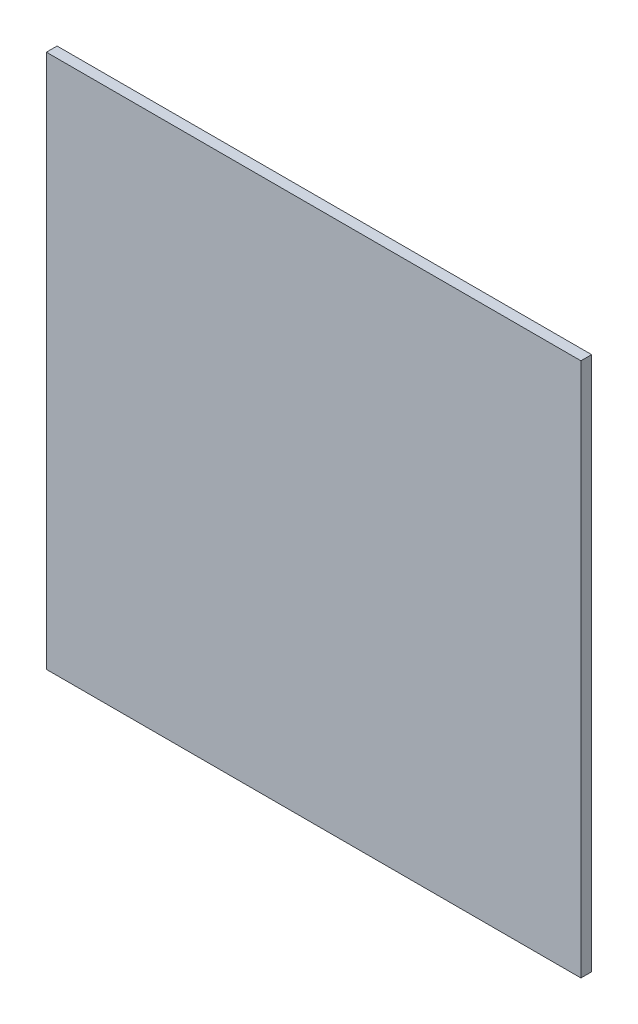
ISO-10303-21;
HEADER;
FILE_DESCRIPTION(('STEP AP214'),'2;1');
FILE_NAME('part.step','',(''),(''),'','','');
FILE_SCHEMA(('AUTOMOTIVE_DESIGN { 1 0 10303 214 1 1 1 1 }'));
ENDSEC;
DATA;
#1=APPLICATION_CONTEXT('core data for automotive mechanical design processes');
#2=APPLICATION_PROTOCOL_DEFINITION('international standard','automotive_design',2000,#1);
#3=PRODUCT_CONTEXT('',#1,'mechanical');
#4=PRODUCT('Part','Part','',(#3));
#5=PRODUCT_RELATED_PRODUCT_CATEGORY('part','',(#4));
#6=PRODUCT_DEFINITION_FORMATION('','',#4);
#7=PRODUCT_DEFINITION_CONTEXT('part definition',#1,'design');
#8=PRODUCT_DEFINITION('design','',#6,#7);
#9=PRODUCT_DEFINITION_SHAPE('','',#8);
#10=(LENGTH_UNIT() NAMED_UNIT(*) SI_UNIT(.MILLI.,.METRE.));
#11=(NAMED_UNIT(*) PLANE_ANGLE_UNIT() SI_UNIT($,.RADIAN.));
#12=(NAMED_UNIT(*) SI_UNIT($,.STERADIAN.) SOLID_ANGLE_UNIT());
#13=UNCERTAINTY_MEASURE_WITH_UNIT(LENGTH_MEASURE(1.E-05),#10,'distance_accuracy_value','');
#14=(GEOMETRIC_REPRESENTATION_CONTEXT(3) GLOBAL_UNCERTAINTY_ASSIGNED_CONTEXT((#13)) GLOBAL_UNIT_ASSIGNED_CONTEXT((#10,
#11,#12)) REPRESENTATION_CONTEXT('',''));
#15=CARTESIAN_POINT('',(0.,0.,0.));
#16=DIRECTION('',(0.,0.,1.));
#17=DIRECTION('',(1.,0.,0.));
#18=AXIS2_PLACEMENT_3D('',#15,#16,#17);
#19=CARTESIAN_POINT('',(-250.,250.,10.));
#20=DIRECTION('',(1.,0.,0.));
#21=DIRECTION('',(0.,0.,-1.));
#22=AXIS2_PLACEMENT_3D('',#19,#20,#21);
#23=PLANE('',#22);
#24=DIRECTION('',(0.,-1.,0.));
#25=VECTOR('',#24,1.);
#26=CARTESIAN_POINT('',(-250.,250.,0.));
#27=LINE('',#26,#25);
#28=CARTESIAN_POINT('',(-250.,250.,0.));
#29=VERTEX_POINT('',#28);
#30=CARTESIAN_POINT('',(-250.,-250.,0.));
#31=VERTEX_POINT('',#30);
#32=EDGE_CURVE('E95',#29,#31,#27,.T.);
#33=ORIENTED_EDGE('',*,*,#32,.T.);
#34=DIRECTION('',(0.,0.,-1.));
#35=VECTOR('',#34,1.);
#36=CARTESIAN_POINT('',(-250.,-250.,10.));
#37=LINE('',#36,#35);
#38=CARTESIAN_POINT('',(-250.,-250.,10.));
#39=VERTEX_POINT('',#38);
#40=EDGE_CURVE('E11',#39,#31,#37,.T.);
#41=ORIENTED_EDGE('',*,*,#40,.F.);
#42=DIRECTION('',(0.,-1.,0.));
#43=VECTOR('',#42,1.);
#44=CARTESIAN_POINT('',(-250.,250.,10.));
#45=LINE('',#44,#43);
#46=CARTESIAN_POINT('',(-250.,250.,10.));
#47=VERTEX_POINT('',#46);
#48=EDGE_CURVE('E81',#47,#39,#45,.T.);
#49=ORIENTED_EDGE('',*,*,#48,.F.);
#50=DIRECTION('',(0.,0.,-1.));
#51=VECTOR('',#50,1.);
#52=CARTESIAN_POINT('',(-250.,250.,10.));
#53=LINE('',#52,#51);
#54=EDGE_CURVE('E48',#47,#29,#53,.T.);
#55=ORIENTED_EDGE('',*,*,#54,.T.);
#56=EDGE_LOOP('',(#33,#41,#49,#55));
#57=FACE_BOUND('',#56,.T.);
#58=ADVANCED_FACE('F32',(#57),#23,.F.);
#59=CARTESIAN_POINT('',(-250.,-250.,10.));
#60=DIRECTION('',(0.,1.,0.));
#61=DIRECTION('',(0.,0.,1.));
#62=AXIS2_PLACEMENT_3D('',#59,#60,#61);
#63=PLANE('',#62);
#64=DIRECTION('',(1.,0.,0.));
#65=VECTOR('',#64,1.);
#66=CARTESIAN_POINT('',(-250.,-250.,0.));
#67=LINE('',#66,#65);
#68=CARTESIAN_POINT('',(250.,-250.,0.));
#69=VERTEX_POINT('',#68);
#70=EDGE_CURVE('E86',#31,#69,#67,.T.);
#71=ORIENTED_EDGE('',*,*,#70,.T.);
#72=DIRECTION('',(0.,0.,-1.));
#73=VECTOR('',#72,1.);
#74=CARTESIAN_POINT('',(250.,-250.,10.));
#75=LINE('',#74,#73);
#76=CARTESIAN_POINT('',(250.,-250.,10.));
#77=VERTEX_POINT('',#76);
#78=EDGE_CURVE('E40',#77,#69,#75,.T.);
#79=ORIENTED_EDGE('',*,*,#78,.F.);
#80=DIRECTION('',(1.,0.,0.));
#81=VECTOR('',#80,1.);
#82=CARTESIAN_POINT('',(-250.,-250.,10.));
#83=LINE('',#82,#81);
#84=EDGE_CURVE('E73',#39,#77,#83,.T.);
#85=ORIENTED_EDGE('',*,*,#84,.F.);
#86=ORIENTED_EDGE('',*,*,#40,.T.);
#87=EDGE_LOOP('',(#71,#79,#85,#86));
#88=FACE_BOUND('',#87,.T.);
#89=ADVANCED_FACE('F85',(#88),#63,.F.);
#90=CARTESIAN_POINT('',(250.,250.,10.));
#91=DIRECTION('',(1.,0.,0.));
#92=DIRECTION('',(0.,1.,0.));
#93=AXIS2_PLACEMENT_3D('',#90,#91,#92);
#94=PLANE('',#93);
#95=DIRECTION('',(0.,-1.,0.));
#96=VECTOR('',#95,1.);
#97=CARTESIAN_POINT('',(250.,250.,0.));
#98=LINE('',#97,#96);
#99=CARTESIAN_POINT('',(250.,250.,0.));
#100=VERTEX_POINT('',#99);
#101=EDGE_CURVE('E98',#100,#69,#98,.T.);
#102=ORIENTED_EDGE('',*,*,#101,.F.);
#103=DIRECTION('',(0.,0.,-1.));
#104=VECTOR('',#103,1.);
#105=CARTESIAN_POINT('',(250.,250.,10.));
#106=LINE('',#105,#104);
#107=CARTESIAN_POINT('',(250.,250.,10.));
#108=VERTEX_POINT('',#107);
#109=EDGE_CURVE('E62',#108,#100,#106,.T.);
#110=ORIENTED_EDGE('',*,*,#109,.F.);
#111=DIRECTION('',(0.,-1.,0.));
#112=VECTOR('',#111,1.);
#113=CARTESIAN_POINT('',(250.,250.,10.));
#114=LINE('',#113,#112);
#115=EDGE_CURVE('E80',#108,#77,#114,.T.);
#116=ORIENTED_EDGE('',*,*,#115,.T.);
#117=ORIENTED_EDGE('',*,*,#78,.T.);
#118=EDGE_LOOP('',(#102,#110,#116,#117));
#119=FACE_BOUND('',#118,.T.);
#120=ADVANCED_FACE('F89',(#119),#94,.T.);
#121=CARTESIAN_POINT('',(-250.,250.,10.));
#122=DIRECTION('',(0.,1.,0.));
#123=DIRECTION('',(0.,0.,1.));
#124=AXIS2_PLACEMENT_3D('',#121,#122,#123);
#125=PLANE('',#124);
#126=DIRECTION('',(1.,0.,0.));
#127=VECTOR('',#126,1.);
#128=CARTESIAN_POINT('',(-250.,250.,0.));
#129=LINE('',#128,#127);
#130=EDGE_CURVE('E100',#29,#100,#129,.T.);
#131=ORIENTED_EDGE('',*,*,#130,.F.);
#132=ORIENTED_EDGE('',*,*,#54,.F.);
#133=DIRECTION('',(1.,0.,0.));
#134=VECTOR('',#133,1.);
#135=CARTESIAN_POINT('',(-250.,250.,10.));
#136=LINE('',#135,#134);
#137=EDGE_CURVE('E90',#47,#108,#136,.T.);
#138=ORIENTED_EDGE('',*,*,#137,.T.);
#139=ORIENTED_EDGE('',*,*,#109,.T.);
#140=EDGE_LOOP('',(#131,#132,#138,#139));
#141=FACE_BOUND('',#140,.T.);
#142=ADVANCED_FACE('F106',(#141),#125,.T.);
#143=CARTESIAN_POINT('',(0.,0.,10.));
#144=DIRECTION('',(0.,0.,1.));
#145=DIRECTION('',(1.,0.,0.));
#146=AXIS2_PLACEMENT_3D('',#143,#144,#145);
#147=PLANE('',#146);
#148=ORIENTED_EDGE('',*,*,#48,.T.);
#149=ORIENTED_EDGE('',*,*,#84,.T.);
#150=ORIENTED_EDGE('',*,*,#115,.F.);
#151=ORIENTED_EDGE('',*,*,#137,.F.);
#152=EDGE_LOOP('',(#148,#149,#150,#151));
#153=FACE_BOUND('',#152,.T.);
#154=ADVANCED_FACE('F77',(#153),#147,.T.);
#155=CARTESIAN_POINT('',(0.,0.,0.));
#156=DIRECTION('',(0.,0.,1.));
#157=DIRECTION('',(1.,0.,0.));
#158=AXIS2_PLACEMENT_3D('',#155,#156,#157);
#159=PLANE('',#158);
#160=ORIENTED_EDGE('',*,*,#32,.F.);
#161=ORIENTED_EDGE('',*,*,#130,.T.);
#162=ORIENTED_EDGE('',*,*,#101,.T.);
#163=ORIENTED_EDGE('',*,*,#70,.F.);
#164=EDGE_LOOP('',(#160,#161,#162,#163));
#165=FACE_BOUND('',#164,.T.);
#166=ADVANCED_FACE('F105',(#165),#159,.F.);
#167=CLOSED_SHELL('',(#58,#89,#120,#142,#154,#166));
#168=MANIFOLD_SOLID_BREP('B2',#167);
#169=ADVANCED_BREP_SHAPE_REPRESENTATION('',(#18,#168),#14);
#170=SHAPE_DEFINITION_REPRESENTATION(#9,#169);
ENDSEC;
END-ISO-10303-21;
